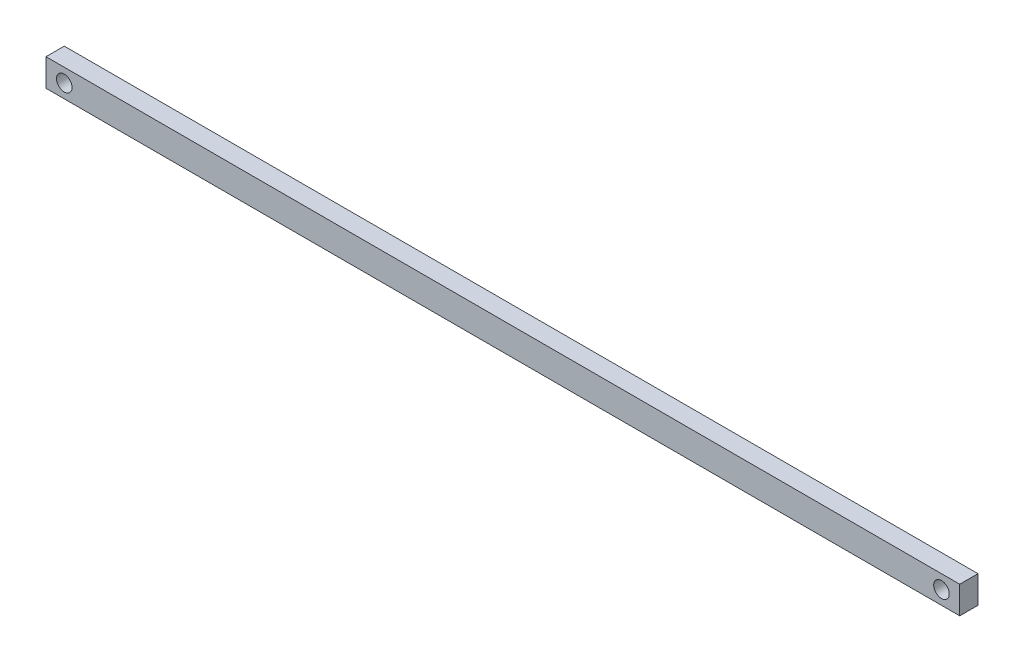
ISO-10303-21;
HEADER;
FILE_DESCRIPTION(('STEP AP214'),'2;1');
FILE_NAME('part.step','',(''),(''),'','','');
FILE_SCHEMA(('AUTOMOTIVE_DESIGN { 1 0 10303 214 1 1 1 1 }'));
ENDSEC;
DATA;
#1=APPLICATION_CONTEXT('core data for automotive mechanical design processes');
#2=APPLICATION_PROTOCOL_DEFINITION('international standard','automotive_design',2000,#1);
#3=PRODUCT_CONTEXT('',#1,'mechanical');
#4=PRODUCT('Part','Part','',(#3));
#5=PRODUCT_RELATED_PRODUCT_CATEGORY('part','',(#4));
#6=PRODUCT_DEFINITION_FORMATION('','',#4);
#7=PRODUCT_DEFINITION_CONTEXT('part definition',#1,'design');
#8=PRODUCT_DEFINITION('design','',#6,#7);
#9=PRODUCT_DEFINITION_SHAPE('','',#8);
#10=(LENGTH_UNIT() NAMED_UNIT(*) SI_UNIT(.MILLI.,.METRE.));
#11=(NAMED_UNIT(*) PLANE_ANGLE_UNIT() SI_UNIT($,.RADIAN.));
#12=(NAMED_UNIT(*) SI_UNIT($,.STERADIAN.) SOLID_ANGLE_UNIT());
#13=UNCERTAINTY_MEASURE_WITH_UNIT(LENGTH_MEASURE(1.E-05),#10,'distance_accuracy_value','');
#14=(GEOMETRIC_REPRESENTATION_CONTEXT(3) GLOBAL_UNCERTAINTY_ASSIGNED_CONTEXT((#13)) GLOBAL_UNIT_ASSIGNED_CONTEXT((#10,
#11,#12)) REPRESENTATION_CONTEXT('',''));
#15=CARTESIAN_POINT('',(0.,0.,0.));
#16=DIRECTION('',(0.,0.,1.));
#17=DIRECTION('',(1.,0.,0.));
#18=AXIS2_PLACEMENT_3D('',#15,#16,#17);
#19=CARTESIAN_POINT('',(0.,0.,10.));
#20=DIRECTION('',(1.,0.,0.));
#21=DIRECTION('',(0.,0.,-1.));
#22=AXIS2_PLACEMENT_3D('',#19,#20,#21);
#23=PLANE('',#22);
#24=DIRECTION('',(0.,-1.,0.));
#25=VECTOR('',#24,1.);
#26=CARTESIAN_POINT('',(0.,0.,0.));
#27=LINE('',#26,#25);
#28=CARTESIAN_POINT('',(0.,15.,0.));
#29=VERTEX_POINT('',#28);
#30=CARTESIAN_POINT('',(0.,0.,0.));
#31=VERTEX_POINT('',#30);
#32=EDGE_CURVE('E104',#29,#31,#27,.T.);
#33=ORIENTED_EDGE('',*,*,#32,.T.);
#34=DIRECTION('',(0.,0.,-1.));
#35=VECTOR('',#34,1.);
#36=CARTESIAN_POINT('',(0.,0.,10.));
#37=LINE('',#36,#35);
#38=CARTESIAN_POINT('',(0.,0.,10.));
#39=VERTEX_POINT('',#38);
#40=EDGE_CURVE('E11',#39,#31,#37,.T.);
#41=ORIENTED_EDGE('',*,*,#40,.F.);
#42=DIRECTION('',(0.,-1.,0.));
#43=VECTOR('',#42,1.);
#44=CARTESIAN_POINT('',(0.,0.,10.));
#45=LINE('',#44,#43);
#46=CARTESIAN_POINT('',(0.,15.,10.));
#47=VERTEX_POINT('',#46);
#48=EDGE_CURVE('E92',#47,#39,#45,.T.);
#49=ORIENTED_EDGE('',*,*,#48,.F.);
#50=DIRECTION('',(0.,0.,-1.));
#51=VECTOR('',#50,1.);
#52=CARTESIAN_POINT('',(0.,15.,10.));
#53=LINE('',#52,#51);
#54=EDGE_CURVE('E100',#47,#29,#53,.T.);
#55=ORIENTED_EDGE('',*,*,#54,.T.);
#56=EDGE_LOOP('',(#33,#41,#49,#55));
#57=FACE_BOUND('',#56,.T.);
#58=ADVANCED_FACE('F41',(#57),#23,.F.);
#59=CARTESIAN_POINT('',(0.,0.,10.));
#60=DIRECTION('',(0.,1.,0.));
#61=DIRECTION('',(0.,0.,1.));
#62=AXIS2_PLACEMENT_3D('',#59,#60,#61);
#63=PLANE('',#62);
#64=DIRECTION('',(1.,0.,0.));
#65=VECTOR('',#64,1.);
#66=CARTESIAN_POINT('',(0.,0.,0.));
#67=LINE('',#66,#65);
#68=CARTESIAN_POINT('',(500.,0.,0.));
#69=VERTEX_POINT('',#68);
#70=EDGE_CURVE('E96',#31,#69,#67,.T.);
#71=ORIENTED_EDGE('',*,*,#70,.T.);
#72=DIRECTION('',(0.,0.,-1.));
#73=VECTOR('',#72,1.);
#74=CARTESIAN_POINT('',(500.,0.,10.));
#75=LINE('',#74,#73);
#76=CARTESIAN_POINT('',(500.,0.,10.));
#77=VERTEX_POINT('',#76);
#78=EDGE_CURVE('E49',#77,#69,#75,.T.);
#79=ORIENTED_EDGE('',*,*,#78,.F.);
#80=DIRECTION('',(1.,0.,0.));
#81=VECTOR('',#80,1.);
#82=CARTESIAN_POINT('',(0.,0.,10.));
#83=LINE('',#82,#81);
#84=EDGE_CURVE('E87',#39,#77,#83,.T.);
#85=ORIENTED_EDGE('',*,*,#84,.F.);
#86=ORIENTED_EDGE('',*,*,#40,.T.);
#87=EDGE_LOOP('',(#71,#79,#85,#86));
#88=FACE_BOUND('',#87,.T.);
#89=ADVANCED_FACE('F95',(#88),#63,.F.);
#90=CARTESIAN_POINT('',(500.,0.,10.));
#91=DIRECTION('',(-1.,0.,0.));
#92=DIRECTION('',(0.,0.,1.));
#93=AXIS2_PLACEMENT_3D('',#90,#91,#92);
#94=PLANE('',#93);
#95=DIRECTION('',(0.,1.,0.));
#96=VECTOR('',#95,1.);
#97=CARTESIAN_POINT('',(500.,0.,0.));
#98=LINE('',#97,#96);
#99=CARTESIAN_POINT('',(500.,15.,0.));
#100=VERTEX_POINT('',#99);
#101=EDGE_CURVE('E74',#69,#100,#98,.T.);
#102=ORIENTED_EDGE('',*,*,#101,.T.);
#103=DIRECTION('',(0.,0.,-1.));
#104=VECTOR('',#103,1.);
#105=CARTESIAN_POINT('',(500.,15.,10.));
#106=LINE('',#105,#104);
#107=CARTESIAN_POINT('',(500.,15.,10.));
#108=VERTEX_POINT('',#107);
#109=EDGE_CURVE('E97',#108,#100,#106,.T.);
#110=ORIENTED_EDGE('',*,*,#109,.F.);
#111=DIRECTION('',(0.,1.,0.));
#112=VECTOR('',#111,1.);
#113=CARTESIAN_POINT('',(500.,0.,10.));
#114=LINE('',#113,#112);
#115=EDGE_CURVE('E90',#77,#108,#114,.T.);
#116=ORIENTED_EDGE('',*,*,#115,.F.);
#117=ORIENTED_EDGE('',*,*,#78,.T.);
#118=EDGE_LOOP('',(#102,#110,#116,#117));
#119=FACE_BOUND('',#118,.T.);
#120=ADVANCED_FACE('F98',(#119),#94,.F.);
#121=CARTESIAN_POINT('',(0.,15.,10.));
#122=DIRECTION('',(0.,-1.,0.));
#123=DIRECTION('',(0.,0.,-1.));
#124=AXIS2_PLACEMENT_3D('',#121,#122,#123);
#125=PLANE('',#124);
#126=DIRECTION('',(-1.,0.,0.));
#127=VECTOR('',#126,1.);
#128=CARTESIAN_POINT('',(0.,15.,0.));
#129=LINE('',#128,#127);
#130=EDGE_CURVE('E80',#100,#29,#129,.T.);
#131=ORIENTED_EDGE('',*,*,#130,.T.);
#132=ORIENTED_EDGE('',*,*,#54,.F.);
#133=DIRECTION('',(-1.,0.,0.));
#134=VECTOR('',#133,1.);
#135=CARTESIAN_POINT('',(0.,15.,10.));
#136=LINE('',#135,#134);
#137=EDGE_CURVE('E57',#108,#47,#136,.T.);
#138=ORIENTED_EDGE('',*,*,#137,.F.);
#139=ORIENTED_EDGE('',*,*,#109,.T.);
#140=EDGE_LOOP('',(#131,#132,#138,#139));
#141=FACE_BOUND('',#140,.T.);
#142=ADVANCED_FACE('F112',(#141),#125,.F.);
#143=CARTESIAN_POINT('',(0.,0.,10.));
#144=DIRECTION('',(0.,0.,-1.));
#145=DIRECTION('',(-1.,0.,0.));
#146=AXIS2_PLACEMENT_3D('',#143,#144,#145);
#147=PLANE('',#146);
#148=CARTESIAN_POINT('',(10.,7.5,10.));
#149=DIRECTION('',(0.,0.,1.));
#150=DIRECTION('',(1.,0.,0.));
#151=AXIS2_PLACEMENT_3D('',#148,#149,#150);
#152=CIRCLE('',#151,4.255);
#153=CARTESIAN_POINT('',(14.255,7.5,10.));
#154=VERTEX_POINT('',#153);
#155=EDGE_CURVE('E121',#154,#154,#152,.T.);
#156=ORIENTED_EDGE('',*,*,#155,.F.);
#157=EDGE_LOOP('',(#156));
#158=FACE_BOUND('',#157,.T.);
#159=CARTESIAN_POINT('',(490.,7.5,10.));
#160=DIRECTION('',(0.,0.,1.));
#161=DIRECTION('',(1.,0.,0.));
#162=AXIS2_PLACEMENT_3D('',#159,#160,#161);
#163=CIRCLE('',#162,4.255);
#164=CARTESIAN_POINT('',(494.255,7.5,10.));
#165=VERTEX_POINT('',#164);
#166=EDGE_CURVE('E118',#165,#165,#163,.T.);
#167=ORIENTED_EDGE('',*,*,#166,.F.);
#168=EDGE_LOOP('',(#167));
#169=FACE_BOUND('',#168,.T.);
#170=ORIENTED_EDGE('',*,*,#48,.T.);
#171=ORIENTED_EDGE('',*,*,#84,.T.);
#172=ORIENTED_EDGE('',*,*,#115,.T.);
#173=ORIENTED_EDGE('',*,*,#137,.T.);
#174=EDGE_LOOP('',(#170,#171,#172,#173));
#175=FACE_BOUND('',#174,.T.);
#176=ADVANCED_FACE('F88',(#158,#169,#175),#147,.F.);
#177=CARTESIAN_POINT('',(0.,0.,0.));
#178=DIRECTION('',(0.,0.,-1.));
#179=DIRECTION('',(-1.,0.,0.));
#180=AXIS2_PLACEMENT_3D('',#177,#178,#179);
#181=PLANE('',#180);
#182=CARTESIAN_POINT('',(10.,7.5,0.));
#183=DIRECTION('',(0.,0.,-1.));
#184=DIRECTION('',(-1.,0.,0.));
#185=AXIS2_PLACEMENT_3D('',#182,#183,#184);
#186=CIRCLE('',#185,4.255);
#187=CARTESIAN_POINT('',(5.74499999999999,7.5,0.));
#188=VERTEX_POINT('',#187);
#189=EDGE_CURVE('E107',#188,#188,#186,.F.);
#190=ORIENTED_EDGE('',*,*,#189,.T.);
#191=EDGE_LOOP('',(#190));
#192=FACE_BOUND('',#191,.T.);
#193=CARTESIAN_POINT('',(490.,7.5,0.));
#194=DIRECTION('',(0.,0.,-1.));
#195=DIRECTION('',(-1.,0.,0.));
#196=AXIS2_PLACEMENT_3D('',#193,#194,#195);
#197=CIRCLE('',#196,4.255);
#198=CARTESIAN_POINT('',(485.745,7.5,0.));
#199=VERTEX_POINT('',#198);
#200=EDGE_CURVE('E122',#199,#199,#197,.F.);
#201=ORIENTED_EDGE('',*,*,#200,.T.);
#202=EDGE_LOOP('',(#201));
#203=FACE_BOUND('',#202,.T.);
#204=ORIENTED_EDGE('',*,*,#32,.F.);
#205=ORIENTED_EDGE('',*,*,#130,.F.);
#206=ORIENTED_EDGE('',*,*,#101,.F.);
#207=ORIENTED_EDGE('',*,*,#70,.F.);
#208=EDGE_LOOP('',(#204,#205,#206,#207));
#209=FACE_BOUND('',#208,.T.);
#210=ADVANCED_FACE('F115',(#192,#203,#209),#181,.T.);
#211=CARTESIAN_POINT('',(490.,7.5,-12.034957415795));
#212=DIRECTION('',(0.,0.,1.));
#213=DIRECTION('',(1.,0.,0.));
#214=AXIS2_PLACEMENT_3D('',#211,#212,#213);
#215=CYLINDRICAL_SURFACE('',#214,4.255);
#216=ORIENTED_EDGE('',*,*,#166,.T.);
#217=EDGE_LOOP('',(#216));
#218=FACE_BOUND('',#217,.T.);
#219=ORIENTED_EDGE('',*,*,#200,.F.);
#220=EDGE_LOOP('',(#219));
#221=FACE_BOUND('',#220,.T.);
#222=ADVANCED_FACE('F138',(#218,#221),#215,.F.);
#223=CARTESIAN_POINT('',(10.,7.5,-12.034957415795));
#224=DIRECTION('',(0.,0.,1.));
#225=DIRECTION('',(1.,0.,0.));
#226=AXIS2_PLACEMENT_3D('',#223,#224,#225);
#227=CYLINDRICAL_SURFACE('',#226,4.255);
#228=ORIENTED_EDGE('',*,*,#155,.T.);
#229=EDGE_LOOP('',(#228));
#230=FACE_BOUND('',#229,.T.);
#231=ORIENTED_EDGE('',*,*,#189,.F.);
#232=EDGE_LOOP('',(#231));
#233=FACE_BOUND('',#232,.T.);
#234=ADVANCED_FACE('F130',(#230,#233),#227,.F.);
#235=CLOSED_SHELL('',(#58,#89,#120,#142,#176,#210,#222,#234));
#236=MANIFOLD_SOLID_BREP('B2',#235);
#237=ADVANCED_BREP_SHAPE_REPRESENTATION('',(#18,#236),#14);
#238=SHAPE_DEFINITION_REPRESENTATION(#9,#237);
ENDSEC;
END-ISO-10303-21;
